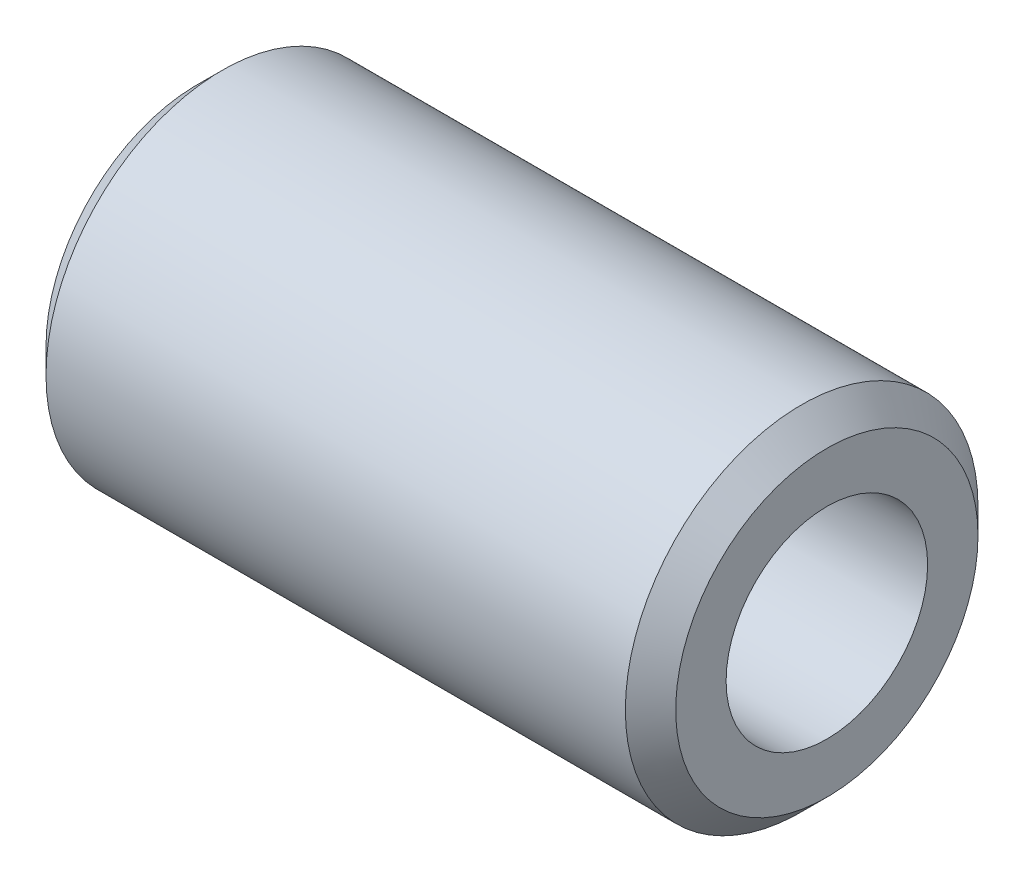
ISO-10303-21;
HEADER;
FILE_DESCRIPTION(('STEP AP214'),'2;1');
FILE_NAME('part.step','',(''),(''),'','','');
FILE_SCHEMA(('AUTOMOTIVE_DESIGN { 1 0 10303 214 1 1 1 1 }'));
ENDSEC;
DATA;
#1=APPLICATION_CONTEXT('core data for automotive mechanical design processes');
#2=APPLICATION_PROTOCOL_DEFINITION('international standard','automotive_design',2000,#1);
#3=PRODUCT_CONTEXT('',#1,'mechanical');
#4=PRODUCT('Part','Part','',(#3));
#5=PRODUCT_RELATED_PRODUCT_CATEGORY('part','',(#4));
#6=PRODUCT_DEFINITION_FORMATION('','',#4);
#7=PRODUCT_DEFINITION_CONTEXT('part definition',#1,'design');
#8=PRODUCT_DEFINITION('design','',#6,#7);
#9=PRODUCT_DEFINITION_SHAPE('','',#8);
#10=(LENGTH_UNIT() NAMED_UNIT(*) SI_UNIT(.MILLI.,.METRE.));
#11=(NAMED_UNIT(*) PLANE_ANGLE_UNIT() SI_UNIT($,.RADIAN.));
#12=(NAMED_UNIT(*) SI_UNIT($,.STERADIAN.) SOLID_ANGLE_UNIT());
#13=UNCERTAINTY_MEASURE_WITH_UNIT(LENGTH_MEASURE(1.E-05),#10,'distance_accuracy_value','');
#14=(GEOMETRIC_REPRESENTATION_CONTEXT(3) GLOBAL_UNCERTAINTY_ASSIGNED_CONTEXT((#13)) GLOBAL_UNIT_ASSIGNED_CONTEXT((#10,
#11,#12)) REPRESENTATION_CONTEXT('',''));
#15=CARTESIAN_POINT('',(0.,0.,0.));
#16=DIRECTION('',(0.,0.,1.));
#17=DIRECTION('',(1.,0.,0.));
#18=AXIS2_PLACEMENT_3D('',#15,#16,#17);
#19=CARTESIAN_POINT('',(0.,0.,0.));
#20=DIRECTION('',(1.,0.,0.));
#21=DIRECTION('',(0.,0.,-1.));
#22=AXIS2_PLACEMENT_3D('',#19,#20,#21);
#23=CYLINDRICAL_SURFACE('',#22,4.);
#24=DIRECTION('',(1.,0.,0.));
#25=VECTOR('',#24,1.);
#26=CARTESIAN_POINT('',(0.,-3.1224989991992,-2.5));
#27=LINE('',#26,#25);
#28=CARTESIAN_POINT('',(5.,-3.1224989991992,-2.5));
#29=VERTEX_POINT('',#28);
#30=CARTESIAN_POINT('',(-5.,-3.1224989991992,-2.5));
#31=VERTEX_POINT('',#30);
#32=EDGE_CURVE('E132',#29,#31,#27,.F.);
#33=ORIENTED_EDGE('',*,*,#32,.F.);
#34=CARTESIAN_POINT('',(5.,-3.1224989991992,-2.5));
#35=CARTESIAN_POINT('',(5.06259152979894,-3.1224698265075,-2.50001478195137));
#36=CARTESIAN_POINT('',(5.12516558574414,-3.12438023146388,-2.49765000899564));
#37=CARTESIAN_POINT('',(5.24967866538005,-3.13185730412988,-2.48827937635117));
#38=CARTESIAN_POINT('',(5.31161830973169,-3.13741996352647,-2.48127860455284));
#39=CARTESIAN_POINT('',(5.43386535834919,-3.1519159203747,-2.46283449114552));
#40=CARTESIAN_POINT('',(5.49418229737516,-3.16081933099102,-2.45143051571305));
#41=CARTESIAN_POINT('',(5.61332147657726,-3.18162220373253,-2.42437048439428));
#42=CARTESIAN_POINT('',(5.6721433689138,-3.19352235618452,-2.40871344871129));
#43=CARTESIAN_POINT('',(5.84534760922224,-3.23296037888671,-2.35582216083459));
#44=CARTESIAN_POINT('',(5.95708253132882,-3.26431612800015,-2.31257207045065));
#45=CARTESIAN_POINT('',(6.1717801890827,-3.33356657451354,-2.21157910045547));
#46=CARTESIAN_POINT('',(6.27472008918314,-3.37147756466322,-2.15379994297389));
#47=CARTESIAN_POINT('',(6.48374615285916,-3.455600456725,-2.01646416958164));
#48=CARTESIAN_POINT('',(6.58843085395559,-3.50224584507656,-1.93503346869445));
#49=CARTESIAN_POINT('',(6.78379848116307,-3.59507271118894,-1.75658803708245));
#50=CARTESIAN_POINT('',(6.87447458679508,-3.64125395280067,-1.65956576176771));
#51=CARTESIAN_POINT('',(7.05028325345176,-3.7346290425709,-1.43825965019518));
#52=CARTESIAN_POINT('',(7.13340034677271,-3.78126294535576,-1.31209535616145));
#53=CARTESIAN_POINT('',(7.2406608506923,-3.84314014147447,-1.11139766451856));
#54=CARTESIAN_POINT('',(7.27350250030836,-3.86241437469942,-1.04261867248746));
#55=CARTESIAN_POINT('',(7.33299272284875,-3.89772726367831,-0.901655428021563));
#56=CARTESIAN_POINT('',(7.35964584949939,-3.91376829737682,-0.829473726769763));
#57=CARTESIAN_POINT('',(7.4020728741673,-3.93950828267075,-0.695725094970947));
#58=CARTESIAN_POINT('',(7.41894435912916,-3.94983033120892,-0.634622938173076));
#59=CARTESIAN_POINT('',(7.44805573103226,-3.96772547077588,-0.510938113476973));
#60=CARTESIAN_POINT('',(7.46029676934557,-3.97529924515078,-0.44835581773668));
#61=CARTESIAN_POINT('',(7.48003731127212,-3.98754577306048,-0.321773564155004));
#62=CARTESIAN_POINT('',(7.48750768932535,-3.99220070357234,-0.257767321312125));
#63=CARTESIAN_POINT('',(7.49749723136141,-3.99843594673735,-0.129177076736932));
#64=CARTESIAN_POINT('',(7.50001292757083,-4.00001410595569,-0.0645927021073464));
#65=CARTESIAN_POINT('',(7.5,-4.,0.));
#66=B_SPLINE_CURVE_WITH_KNOTS('',3,(#34,#35,#36,#37,#38,#39,#40,#41,#42,#43,#44,#45,#46,#47,#48,
#49,#50,#51,#52,#53,#54,#55,#56,#57,#58,#59,#60,#61,#62,#63,#64,#65),.UNSPECIFIED.,.F.,.F.,(4,2,
2,2,2,2,2,2,2,2,2,2,2,2,2,4),(0.,0.187672540035425,0.375139454836844,0.560967771467721,
0.74683893456744,1.11672541852549,1.48754481183989,1.90766805925379,2.32799521519967,
2.79944306314116,3.03498506135361,3.27035318653396,3.46279855247997,3.65519603490272,
3.84875717671509,4.0424537435674),.UNSPECIFIED.);
#67=CARTESIAN_POINT('',(7.5,-4.,0.));
#68=VERTEX_POINT('',#67);
#69=EDGE_CURVE('E64',#29,#68,#66,.T.);
#70=ORIENTED_EDGE('',*,*,#69,.T.);
#71=CARTESIAN_POINT('',(7.5,-4.,0.));
#72=CARTESIAN_POINT('',(7.50001193605715,-4.00001314958439,0.0638257610720841));
#73=CARTESIAN_POINT('',(7.49755614720496,-3.99847273261745,0.127642623087671));
#74=CARTESIAN_POINT('',(7.48780169666695,-3.99238409529656,0.254727860082518));
#75=CARTESIAN_POINT('',(7.48050559689175,-3.98783746609403,0.317996507287695));
#76=CARTESIAN_POINT('',(7.46121822420798,-3.97586985460146,0.443164299501127));
#77=CARTESIAN_POINT('',(7.44925403736718,-3.96846545683401,0.505069206791391));
#78=CARTESIAN_POINT('',(7.42080200293188,-3.95096923485964,0.627429872814449));
#79=CARTESIAN_POINT('',(7.40431375732903,-3.94087717420533,0.687885503536688));
#80=CARTESIAN_POINT('',(7.34841663125765,-3.90693858294924,0.866263657143072));
#81=CARTESIAN_POINT('',(7.30252301085177,-3.87939615794153,0.981528933639002));
#82=CARTESIAN_POINT('',(7.19530175500122,-3.81673453473894,1.2024061599623));
#83=CARTESIAN_POINT('',(7.13395635860788,-3.78160662413054,1.30800680909392));
#84=CARTESIAN_POINT('',(6.9922363741172,-3.70340804306448,1.51593096857552));
#85=CARTESIAN_POINT('',(6.91074077470292,-3.65992898397767,1.61733532932201));
#86=CARTESIAN_POINT('',(6.73358062093135,-3.57063658447261,1.80595572464618));
#87=CARTESIAN_POINT('',(6.63789401602464,-3.52481968542977,1.89314922716827));
#88=CARTESIAN_POINT('',(6.41982139397636,-3.42855754334044,2.06294666903715));
#89=CARTESIAN_POINT('',(6.29557378722724,-3.37833388563042,2.1433006665183));
#90=CARTESIAN_POINT('',(6.03256451387882,-3.28651620868879,2.28160306539043));
#91=CARTESIAN_POINT('',(5.89385843403,-3.24489084903861,2.3396335271257));
#92=CARTESIAN_POINT('',(5.69016368958063,-3.19733977050394,2.40365451060931));
#93=CARTESIAN_POINT('',(5.62988028905404,-3.18482838391431,2.42016370309166));
#94=CARTESIAN_POINT('',(5.50770697834502,-3.16293537999247,2.44870631097023));
#95=CARTESIAN_POINT('',(5.44581770640067,-3.15355253917935,2.46074147623712));
#96=CARTESIAN_POINT('',(5.32030264235196,-3.13826280629678,2.48021590543506));
#97=CARTESIAN_POINT('',(5.25666614114976,-3.13238851355115,2.48761209758571));
#98=CARTESIAN_POINT('',(5.12869373277103,-3.12448787021896,2.49751556711489));
#99=CARTESIAN_POINT('',(5.06435700236886,-3.12246668852206,2.50001627739991));
#100=CARTESIAN_POINT('',(5.,-3.1224989991992,2.5));
#101=B_SPLINE_CURVE_WITH_KNOTS('',3,(#71,#72,#73,#74,#75,#76,#77,#78,#79,#80,#81,#82,#83,#84,
#85,#86,#87,#88,#89,#90,#91,#92,#93,#94,#95,#96,#97,#98,#99,#100),.UNSPECIFIED.,.F.,.F.,(4,2,2,
2,2,2,2,2,2,2,2,2,2,2,4),(0.,0.191396831954318,0.382692440910332,0.572894200838622,
0.763112699315308,1.14255082037376,1.52242709058589,1.93233645262155,2.342889554098,
2.80946660092483,3.27431175729393,3.46533839484617,3.65629023972008,3.8489897566303,
4.04194759559401),.UNSPECIFIED.);
#102=CARTESIAN_POINT('',(5.,-3.1224989991992,2.5));
#103=VERTEX_POINT('',#102);
#104=EDGE_CURVE('E130',#68,#103,#101,.T.);
#105=ORIENTED_EDGE('',*,*,#104,.T.);
#106=DIRECTION('',(1.,0.,0.));
#107=VECTOR('',#106,1.);
#108=CARTESIAN_POINT('',(0.,-3.1224989991992,2.5));
#109=LINE('',#108,#107);
#110=CARTESIAN_POINT('',(-5.,-3.1224989991992,2.5));
#111=VERTEX_POINT('',#110);
#112=EDGE_CURVE('E121',#111,#103,#109,.T.);
#113=ORIENTED_EDGE('',*,*,#112,.F.);
#114=CARTESIAN_POINT('',(-5.,-3.1224989991992,2.5));
#115=CARTESIAN_POINT('',(-5.06259152979894,-3.1224698265075,2.50001478195137));
#116=CARTESIAN_POINT('',(-5.12516558574414,-3.12438023146388,2.49765000899564));
#117=CARTESIAN_POINT('',(-5.24967866538004,-3.13185730412988,2.48827937635117));
#118=CARTESIAN_POINT('',(-5.31161830973169,-3.13741996352647,2.48127860455283));
#119=CARTESIAN_POINT('',(-5.43386535834919,-3.1519159203747,2.46283449114552));
#120=CARTESIAN_POINT('',(-5.49418229737516,-3.16081933099102,2.45143051571305));
#121=CARTESIAN_POINT('',(-5.61332147657726,-3.18162220373253,2.42437048439428));
#122=CARTESIAN_POINT('',(-5.67214336891379,-3.19352235618452,2.40871344871129));
#123=CARTESIAN_POINT('',(-5.84534760922224,-3.23296037888671,2.35582216083459));
#124=CARTESIAN_POINT('',(-5.95708253132882,-3.26431612800015,2.31257207045065));
#125=CARTESIAN_POINT('',(-6.1717801890827,-3.33356657451354,2.21157910045547));
#126=CARTESIAN_POINT('',(-6.27472008918314,-3.37147756466322,2.15379994297389));
#127=CARTESIAN_POINT('',(-6.48374615285916,-3.455600456725,2.01646416958164));
#128=CARTESIAN_POINT('',(-6.58843085395558,-3.50224584507656,1.93503346869445));
#129=CARTESIAN_POINT('',(-6.78379848116306,-3.59507271118894,1.75658803708245));
#130=CARTESIAN_POINT('',(-6.87447458679508,-3.64125395280067,1.65956576176771));
#131=CARTESIAN_POINT('',(-7.05028325345176,-3.73462904257091,1.43825965019518));
#132=CARTESIAN_POINT('',(-7.13340034677271,-3.78126294535576,1.31209535616145));
#133=CARTESIAN_POINT('',(-7.2406608506923,-3.84314014147447,1.11139766451856));
#134=CARTESIAN_POINT('',(-7.27350250030836,-3.86241437469942,1.04261867248746));
#135=CARTESIAN_POINT('',(-7.33299272284875,-3.89772726367831,0.901655428021563));
#136=CARTESIAN_POINT('',(-7.35964584949939,-3.91376829737682,0.829473726769764));
#137=CARTESIAN_POINT('',(-7.40207287416729,-3.93950828267075,0.695725094970947));
#138=CARTESIAN_POINT('',(-7.41894435912916,-3.94983033120892,0.634622938173077));
#139=CARTESIAN_POINT('',(-7.44805573103225,-3.96772547077588,0.510938113476973));
#140=CARTESIAN_POINT('',(-7.46029676934557,-3.97529924515078,0.44835581773668));
#141=CARTESIAN_POINT('',(-7.48003731127211,-3.98754577306048,0.321773564155003));
#142=CARTESIAN_POINT('',(-7.48750768932534,-3.99220070357234,0.257767321312124));
#143=CARTESIAN_POINT('',(-7.49749723136141,-3.99843594673735,0.129177076736931));
#144=CARTESIAN_POINT('',(-7.50001292757083,-4.00001410595569,0.0645927021073454));
#145=CARTESIAN_POINT('',(-7.5,-4.,0.));
#146=B_SPLINE_CURVE_WITH_KNOTS('',3,(#114,#115,#116,#117,#118,#119,#120,#121,#122,#123,#124,
#125,#126,#127,#128,#129,#130,#131,#132,#133,#134,#135,#136,#137,#138,#139,#140,#141,#142,#143,
#144,#145),.UNSPECIFIED.,.F.,.F.,(4,2,2,2,2,2,2,2,2,2,2,2,2,2,2,4),(0.,0.187672540035425,
0.375139454836844,0.56096777146772,0.74683893456744,1.11672541852549,1.48754481183989,
1.90766805925379,2.32799521519967,2.79944306314116,3.03498506135361,3.27035318653396,
3.46279855247997,3.65519603490272,3.84875717671509,4.0424537435674),.UNSPECIFIED.);
#147=CARTESIAN_POINT('',(-7.5,-4.,0.));
#148=VERTEX_POINT('',#147);
#149=EDGE_CURVE('E103',#111,#148,#146,.T.);
#150=ORIENTED_EDGE('',*,*,#149,.T.);
#151=CARTESIAN_POINT('',(-7.5,-4.,0.));
#152=CARTESIAN_POINT('',(-7.50001193605714,-4.00001314958439,-0.0638257610720846));
#153=CARTESIAN_POINT('',(-7.49755614720495,-3.99847273261745,-0.127642623087671));
#154=CARTESIAN_POINT('',(-7.48780169666695,-3.99238409529656,-0.254727860082518));
#155=CARTESIAN_POINT('',(-7.48050559689175,-3.98783746609403,-0.317996507287695));
#156=CARTESIAN_POINT('',(-7.46121822420798,-3.97586985460146,-0.443164299501128));
#157=CARTESIAN_POINT('',(-7.44925403736717,-3.96846545683401,-0.505069206791391));
#158=CARTESIAN_POINT('',(-7.42080200293188,-3.95096923485964,-0.627429872814449));
#159=CARTESIAN_POINT('',(-7.40431375732902,-3.94087717420533,-0.687885503536688));
#160=CARTESIAN_POINT('',(-7.34841663125765,-3.90693858294924,-0.866263657143073));
#161=CARTESIAN_POINT('',(-7.30252301085176,-3.87939615794153,-0.981528933639002));
#162=CARTESIAN_POINT('',(-7.19530175500122,-3.81673453473894,-1.2024061599623));
#163=CARTESIAN_POINT('',(-7.13395635860788,-3.78160662413054,-1.30800680909392));
#164=CARTESIAN_POINT('',(-6.99223637411719,-3.70340804306448,-1.51593096857552));
#165=CARTESIAN_POINT('',(-6.91074077470292,-3.65992898397767,-1.61733532932201));
#166=CARTESIAN_POINT('',(-6.73358062093134,-3.57063658447261,-1.80595572464618));
#167=CARTESIAN_POINT('',(-6.63789401602464,-3.52481968542977,-1.89314922716827));
#168=CARTESIAN_POINT('',(-6.41982139397635,-3.42855754334043,-2.06294666903715));
#169=CARTESIAN_POINT('',(-6.29557378722723,-3.37833388563042,-2.1433006665183));
#170=CARTESIAN_POINT('',(-6.03256451387881,-3.28651620868879,-2.28160306539043));
#171=CARTESIAN_POINT('',(-5.89385843403,-3.24489084903861,-2.3396335271257));
#172=CARTESIAN_POINT('',(-5.69016368958062,-3.19733977050394,-2.40365451060932));
#173=CARTESIAN_POINT('',(-5.62988028905403,-3.1848283839143,-2.42016370309166));
#174=CARTESIAN_POINT('',(-5.50770697834502,-3.16293537999247,-2.44870631097023));
#175=CARTESIAN_POINT('',(-5.44581770640067,-3.15355253917935,-2.46074147623712));
#176=CARTESIAN_POINT('',(-5.32030264235195,-3.13826280629678,-2.48021590543506));
#177=CARTESIAN_POINT('',(-5.25666614114976,-3.13238851355115,-2.48761209758571));
#178=CARTESIAN_POINT('',(-5.12869373277103,-3.12448787021896,-2.49751556711489));
#179=CARTESIAN_POINT('',(-5.06435700236885,-3.12246668852206,-2.50001627739991));
#180=CARTESIAN_POINT('',(-5.,-3.1224989991992,-2.5));
#181=B_SPLINE_CURVE_WITH_KNOTS('',3,(#151,#152,#153,#154,#155,#156,#157,#158,#159,#160,#161,
#162,#163,#164,#165,#166,#167,#168,#169,#170,#171,#172,#173,#174,#175,#176,#177,#178,#179,#180),
.UNSPECIFIED.,.F.,.F.,(4,2,2,2,2,2,2,2,2,2,2,2,2,2,4),(0.,0.191396831954318,0.382692440910332,
0.572894200838622,0.763112699315308,1.14255082037376,1.52242709058589,1.93233645262155,
2.342889554098,2.80946660092483,3.27431175729394,3.46533839484617,3.65629023972008,
3.8489897566303,4.04194759559401),.UNSPECIFIED.);
#182=EDGE_CURVE('E206',#148,#31,#181,.T.);
#183=ORIENTED_EDGE('',*,*,#182,.T.);
#184=EDGE_LOOP('',(#33,#70,#105,#113,#150,#183));
#185=FACE_BOUND('',#184,.T.);
#186=CARTESIAN_POINT('',(-12.475,0.,0.));
#187=DIRECTION('',(-1.,0.,0.));
#188=DIRECTION('',(0.,0.,1.));
#189=AXIS2_PLACEMENT_3D('',#186,#187,#188);
#190=CIRCLE('',#189,4.);
#191=CARTESIAN_POINT('',(-12.475,0.,4.));
#192=VERTEX_POINT('',#191);
#193=EDGE_CURVE('E145',#192,#192,#190,.T.);
#194=ORIENTED_EDGE('',*,*,#193,.T.);
#195=EDGE_LOOP('',(#194));
#196=FACE_BOUND('',#195,.T.);
#197=CARTESIAN_POINT('',(12.5,0.,0.));
#198=DIRECTION('',(1.,0.,0.));
#199=DIRECTION('',(0.,0.,-1.));
#200=AXIS2_PLACEMENT_3D('',#197,#198,#199);
#201=CIRCLE('',#200,4.);
#202=CARTESIAN_POINT('',(12.5,0.,-4.));
#203=VERTEX_POINT('',#202);
#204=EDGE_CURVE('E149',#203,#203,#201,.T.);
#205=ORIENTED_EDGE('',*,*,#204,.T.);
#206=EDGE_LOOP('',(#205));
#207=FACE_BOUND('',#206,.T.);
#208=ADVANCED_FACE('F47',(#185,#196,#207),#23,.F.);
#209=CARTESIAN_POINT('',(-12.5,4.,0.));
#210=DIRECTION('',(-1.,0.,0.));
#211=DIRECTION('',(0.,0.,1.));
#212=AXIS2_PLACEMENT_3D('',#209,#210,#211);
#213=PLANE('',#212);
#214=CARTESIAN_POINT('',(-12.5,0.,0.));
#215=DIRECTION('',(-1.,0.,0.));
#216=DIRECTION('',(0.,0.,1.));
#217=AXIS2_PLACEMENT_3D('',#214,#215,#216);
#218=CIRCLE('',#217,6.);
#219=CARTESIAN_POINT('',(-12.5,0.,6.));
#220=VERTEX_POINT('',#219);
#221=EDGE_CURVE('E11',#220,#220,#218,.T.);
#222=ORIENTED_EDGE('',*,*,#221,.T.);
#223=EDGE_LOOP('',(#222));
#224=FACE_BOUND('',#223,.T.);
#225=CARTESIAN_POINT('',(-12.5,0.,0.));
#226=DIRECTION('',(-1.,0.,0.));
#227=DIRECTION('',(0.,0.,1.));
#228=AXIS2_PLACEMENT_3D('',#225,#226,#227);
#229=CIRCLE('',#228,4.025);
#230=CARTESIAN_POINT('',(-12.5,0.,4.025));
#231=VERTEX_POINT('',#230);
#232=EDGE_CURVE('E137',#231,#231,#229,.T.);
#233=ORIENTED_EDGE('',*,*,#232,.F.);
#234=EDGE_LOOP('',(#233));
#235=FACE_BOUND('',#234,.T.);
#236=ADVANCED_FACE('F187',(#224,#235),#213,.T.);
#237=CARTESIAN_POINT('',(0.,0.,0.));
#238=DIRECTION('',(1.,0.,0.));
#239=DIRECTION('',(0.,0.,-1.));
#240=AXIS2_PLACEMENT_3D('',#237,#238,#239);
#241=CYLINDRICAL_SURFACE('',#240,7.);
#242=CARTESIAN_POINT('',(11.5,0.,0.));
#243=DIRECTION('',(1.,0.,0.));
#244=DIRECTION('',(0.,0.,-1.));
#245=AXIS2_PLACEMENT_3D('',#242,#243,#244);
#246=CIRCLE('',#245,7.);
#247=CARTESIAN_POINT('',(11.5,0.,-7.));
#248=VERTEX_POINT('',#247);
#249=EDGE_CURVE('E57',#248,#248,#246,.F.);
#250=ORIENTED_EDGE('',*,*,#249,.T.);
#251=EDGE_LOOP('',(#250));
#252=FACE_BOUND('',#251,.T.);
#253=CARTESIAN_POINT('',(-11.5,0.,0.));
#254=DIRECTION('',(-1.,0.,0.));
#255=DIRECTION('',(0.,0.,1.));
#256=AXIS2_PLACEMENT_3D('',#253,#254,#255);
#257=CIRCLE('',#256,7.);
#258=CARTESIAN_POINT('',(-11.5,0.,7.));
#259=VERTEX_POINT('',#258);
#260=EDGE_CURVE('E272',#259,#259,#257,.F.);
#261=ORIENTED_EDGE('',*,*,#260,.T.);
#262=EDGE_LOOP('',(#261));
#263=FACE_BOUND('',#262,.T.);
#264=DIRECTION('',(1.,0.,0.));
#265=VECTOR('',#264,1.);
#266=CARTESIAN_POINT('',(0.,-6.53834841531101,-2.5));
#267=LINE('',#266,#265);
#268=CARTESIAN_POINT('',(-5.,-6.53834841531101,-2.5));
#269=VERTEX_POINT('',#268);
#270=CARTESIAN_POINT('',(5.,-6.53834841531101,-2.5));
#271=VERTEX_POINT('',#270);
#272=EDGE_CURVE('E153',#269,#271,#267,.T.);
#273=ORIENTED_EDGE('',*,*,#272,.F.);
#274=CARTESIAN_POINT('',(-5.,-6.53834841531101,-2.5));
#275=CARTESIAN_POINT('',(-5.06789176061319,-6.53833653584086,-2.50000932444623));
#276=CARTESIAN_POINT('',(-5.13577696395944,-6.53940557744183,-2.49723464622262));
#277=CARTESIAN_POINT('',(-5.27101390792753,-6.54361696384382,-2.48618999898007));
#278=CARTESIAN_POINT('',(-5.3383658055703,-6.54675867353284,-2.47792171332017));
#279=CARTESIAN_POINT('',(-5.4718337089638,-6.55501308694937,-2.45599932254301));
#280=CARTESIAN_POINT('',(-5.5379531031587,-6.56011914226912,-2.44236338090026));
#281=CARTESIAN_POINT('',(-5.66870663911945,-6.57213229216529,-2.4098497499207));
#282=CARTESIAN_POINT('',(-5.73334071515927,-6.57903946627573,-2.39097182910556));
#283=CARTESIAN_POINT('',(-5.92426199510417,-6.60214905554765,-2.32674044961539));
#284=CARTESIAN_POINT('',(-6.04778583702168,-6.62075405324683,-2.27375315805254));
#285=CARTESIAN_POINT('',(-6.28422613371172,-6.66225312605043,-2.14911019465095));
#286=CARTESIAN_POINT('',(-6.39713437889781,-6.68515048034754,-2.07744023352399));
#287=CARTESIAN_POINT('',(-6.61421388163472,-6.73379882868167,-1.91402689638811));
#288=CARTESIAN_POINT('',(-6.71784388888591,-6.75962796045009,-1.82158634721562));
#289=CARTESIAN_POINT('',(-6.90850682770127,-6.81057540983754,-1.6207356137859));
#290=CARTESIAN_POINT('',(-6.99553627842698,-6.83569357744193,-1.51232208871062));
#291=CARTESIAN_POINT('',(-7.1531158225099,-6.88331907970163,-1.27850282117259));
#292=CARTESIAN_POINT('',(-7.22307567112586,-6.90572214958253,-1.1526765067236));
#293=CARTESIAN_POINT('',(-7.34057095983549,-6.94443563272108,-0.89014739690569));
#294=CARTESIAN_POINT('',(-7.38812893226777,-6.96075216451012,-0.753455692686566));
#295=CARTESIAN_POINT('',(-7.44886401771556,-6.98185946377716,-0.513511625377527));
#296=CARTESIAN_POINT('',(-7.46798767096466,-6.98861309237481,-0.411899416502108));
#297=CARTESIAN_POINT('',(-7.49357555188223,-6.99770556810293,-0.206881971872087));
#298=CARTESIAN_POINT('',(-7.50003713488843,-7.0000434929441,-0.103476366088815));
#299=CARTESIAN_POINT('',(-7.5,-7.,0.));
#300=B_SPLINE_CURVE_WITH_KNOTS('',3,(#274,#275,#276,#277,#278,#279,#280,#281,#282,#283,#284,
#285,#286,#287,#288,#289,#290,#291,#292,#293,#294,#295,#296,#297,#298,#299),.UNSPECIFIED.,.F.,
.F.,(4,2,2,2,2,2,2,2,2,2,2,2,4),(0.,0.20359916941444,0.407135980434993,0.609989888714331,
0.812852756157981,1.21792365461531,1.62330528194946,2.04515480156738,2.46709267844889,
2.90202857788652,3.33652606938374,3.64653458164688,3.95660783691393),.UNSPECIFIED.);
#301=CARTESIAN_POINT('',(-7.5,-7.,0.));
#302=VERTEX_POINT('',#301);
#303=EDGE_CURVE('E113',#269,#302,#300,.T.);
#304=ORIENTED_EDGE('',*,*,#303,.T.);
#305=CARTESIAN_POINT('',(-7.5,-7.,0.));
#306=CARTESIAN_POINT('',(-7.50000899848492,-7.00000923760042,0.0680316354236896));
#307=CARTESIAN_POINT('',(-7.49722320824895,-6.99900844265461,0.136057516067305));
#308=CARTESIAN_POINT('',(-7.4861319263351,-6.99505559924321,0.271584003896382));
#309=CARTESIAN_POINT('',(-7.4778278304321,-6.99210404419495,0.339084739542818));
#310=CARTESIAN_POINT('',(-7.45580320785774,-6.98433023755783,0.472878818341559));
#311=CARTESIAN_POINT('',(-7.44209918989002,-6.97951368842146,0.539175203194541));
#312=CARTESIAN_POINT('',(-7.40941651097459,-6.9681457781704,0.670285587677923));
#313=CARTESIAN_POINT('',(-7.39043768673369,-6.96159436334944,0.735099541349176));
#314=CARTESIAN_POINT('',(-7.32584074985354,-6.93958707549098,0.926587541362261));
#315=CARTESIAN_POINT('',(-7.27253121921836,-6.92176667352062,1.05049342897248));
#316=CARTESIAN_POINT('',(-7.14713334675938,-6.88161823369573,1.28757525627015));
#317=CARTESIAN_POINT('',(-7.07503352762804,-6.85928744272988,1.40074458012211));
#318=CARTESIAN_POINT('',(-6.91116162444242,-6.81147497344679,1.61757767656566));
#319=CARTESIAN_POINT('',(-6.81878957781817,-6.78591039583009,1.72077041364006));
#320=CARTESIAN_POINT('',(-6.61826078564764,-6.73493703362114,1.91057710564824));
#321=CARTESIAN_POINT('',(-6.5100986430393,-6.70952830540495,1.99718536850876));
#322=CARTESIAN_POINT('',(-6.27655772792873,-6.66079107873139,2.15426840345264));
#323=CARTESIAN_POINT('',(-6.150716146969,-6.63756364189772,2.22408896193838));
#324=CARTESIAN_POINT('',(-5.88817332242702,-6.5971282744709,2.34131680574064));
#325=CARTESIAN_POINT('',(-5.75148486925552,-6.57991337973655,2.38875004413019));
#326=CARTESIAN_POINT('',(-5.5118685819719,-6.55760626901444,2.44919145806357));
#327=CARTESIAN_POINT('',(-5.41060709353911,-6.55044807772745,2.46818785834143));
#328=CARTESIAN_POINT('',(-5.20625652174837,-6.54079023433991,2.49361416582955));
#329=CARTESIAN_POINT('',(-5.10316659319683,-6.53829279648032,2.50003810015567));
#330=CARTESIAN_POINT('',(-5.,-6.53834841531101,2.5));
#331=B_SPLINE_CURVE_WITH_KNOTS('',3,(#305,#306,#307,#308,#309,#310,#311,#312,#313,#314,#315,
#316,#317,#318,#319,#320,#321,#322,#323,#324,#325,#326,#327,#328,#329,#330),.UNSPECIFIED.,.F.,
.F.,(4,2,2,2,2,2,2,2,2,2,2,2,4),(0.,0.204020782660766,0.407989980874049,0.611340380857897,
0.814697076700547,1.220851747484,1.62725508567165,2.04787574926896,2.46864051928115,
2.90381733373915,3.33848841163286,3.64747417056643,3.95660668580006),.UNSPECIFIED.);
#332=CARTESIAN_POINT('',(-5.,-6.53834841531101,2.5));
#333=VERTEX_POINT('',#332);
#334=EDGE_CURVE('E114',#302,#333,#331,.T.);
#335=ORIENTED_EDGE('',*,*,#334,.T.);
#336=DIRECTION('',(1.,0.,0.));
#337=VECTOR('',#336,1.);
#338=CARTESIAN_POINT('',(0.,-6.53834841531101,2.5));
#339=LINE('',#338,#337);
#340=CARTESIAN_POINT('',(5.,-6.53834841531101,2.5));
#341=VERTEX_POINT('',#340);
#342=EDGE_CURVE('E123',#341,#333,#339,.F.);
#343=ORIENTED_EDGE('',*,*,#342,.F.);
#344=CARTESIAN_POINT('',(5.,-6.53834841531101,2.5));
#345=CARTESIAN_POINT('',(5.06789176061319,-6.53833653584086,2.50000932444623));
#346=CARTESIAN_POINT('',(5.13577696395944,-6.53940557744183,2.49723464622262));
#347=CARTESIAN_POINT('',(5.27101390792753,-6.54361696384382,2.48618999898007));
#348=CARTESIAN_POINT('',(5.3383658055703,-6.54675867353284,2.47792171332017));
#349=CARTESIAN_POINT('',(5.4718337089638,-6.55501308694937,2.45599932254301));
#350=CARTESIAN_POINT('',(5.5379531031587,-6.56011914226912,2.44236338090026));
#351=CARTESIAN_POINT('',(5.66870663911946,-6.57213229216529,2.4098497499207));
#352=CARTESIAN_POINT('',(5.73334071515928,-6.57903946627573,2.39097182910556));
#353=CARTESIAN_POINT('',(5.92426199510418,-6.60214905554765,2.32674044961539));
#354=CARTESIAN_POINT('',(6.04778583702169,-6.62075405324683,2.27375315805254));
#355=CARTESIAN_POINT('',(6.28422613371173,-6.66225312605043,2.14911019465095));
#356=CARTESIAN_POINT('',(6.39713437889782,-6.68515048034754,2.07744023352399));
#357=CARTESIAN_POINT('',(6.61421388163472,-6.73379882868167,1.91402689638811));
#358=CARTESIAN_POINT('',(6.71784388888591,-6.75962796045009,1.82158634721561));
#359=CARTESIAN_POINT('',(6.90850682770127,-6.81057540983754,1.6207356137859));
#360=CARTESIAN_POINT('',(6.99553627842699,-6.83569357744193,1.51232208871062));
#361=CARTESIAN_POINT('',(7.1531158225099,-6.88331907970163,1.27850282117259));
#362=CARTESIAN_POINT('',(7.22307567112587,-6.90572214958253,1.1526765067236));
#363=CARTESIAN_POINT('',(7.3405709598355,-6.94443563272108,0.89014739690569));
#364=CARTESIAN_POINT('',(7.38812893226777,-6.96075216451012,0.753455692686565));
#365=CARTESIAN_POINT('',(7.44886401771556,-6.98185946377716,0.513511625377526));
#366=CARTESIAN_POINT('',(7.46798767096467,-6.98861309237481,0.411899416502108));
#367=CARTESIAN_POINT('',(7.49357555188223,-6.99770556810293,0.206881971872087));
#368=CARTESIAN_POINT('',(7.50003713488843,-7.0000434929441,0.103476366088815));
#369=CARTESIAN_POINT('',(7.5,-7.,0.));
#370=B_SPLINE_CURVE_WITH_KNOTS('',3,(#344,#345,#346,#347,#348,#349,#350,#351,#352,#353,#354,
#355,#356,#357,#358,#359,#360,#361,#362,#363,#364,#365,#366,#367,#368,#369),.UNSPECIFIED.,.F.,
.F.,(4,2,2,2,2,2,2,2,2,2,2,2,4),(0.,0.20359916941444,0.407135980434993,0.609989888714331,
0.812852756157981,1.21792365461531,1.62330528194946,2.04515480156738,2.46709267844889,
2.90202857788652,3.33652606938374,3.64653458164688,3.95660783691393),.UNSPECIFIED.);
#371=CARTESIAN_POINT('',(7.5,-7.,0.));
#372=VERTEX_POINT('',#371);
#373=EDGE_CURVE('E72',#341,#372,#370,.T.);
#374=ORIENTED_EDGE('',*,*,#373,.T.);
#375=CARTESIAN_POINT('',(7.5,-7.,0.));
#376=CARTESIAN_POINT('',(7.50000899848493,-7.00000923760042,-0.0680316354236901));
#377=CARTESIAN_POINT('',(7.49722320824896,-6.99900844265461,-0.136057516067306));
#378=CARTESIAN_POINT('',(7.48613192633511,-6.99505559924321,-0.271584003896382));
#379=CARTESIAN_POINT('',(7.4778278304321,-6.99210404419495,-0.339084739542819));
#380=CARTESIAN_POINT('',(7.45580320785775,-6.98433023755783,-0.47287881834156));
#381=CARTESIAN_POINT('',(7.44209918989003,-6.97951368842146,-0.539175203194542));
#382=CARTESIAN_POINT('',(7.4094165109746,-6.9681457781704,-0.670285587677924));
#383=CARTESIAN_POINT('',(7.39043768673369,-6.96159436334944,-0.735099541349177));
#384=CARTESIAN_POINT('',(7.32584074985354,-6.93958707549098,-0.926587541362262));
#385=CARTESIAN_POINT('',(7.27253121921836,-6.92176667352062,-1.05049342897248));
#386=CARTESIAN_POINT('',(7.14713334675938,-6.88161823369573,-1.28757525627015));
#387=CARTESIAN_POINT('',(7.07503352762804,-6.85928744272988,-1.40074458012211));
#388=CARTESIAN_POINT('',(6.91116162444242,-6.81147497344679,-1.61757767656566));
#389=CARTESIAN_POINT('',(6.81878957781817,-6.78591039583009,-1.72077041364006));
#390=CARTESIAN_POINT('',(6.61826078564764,-6.73493703362114,-1.91057710564824));
#391=CARTESIAN_POINT('',(6.5100986430393,-6.70952830540495,-1.99718536850876));
#392=CARTESIAN_POINT('',(6.27655772792873,-6.66079107873139,-2.15426840345264));
#393=CARTESIAN_POINT('',(6.150716146969,-6.63756364189772,-2.22408896193838));
#394=CARTESIAN_POINT('',(5.88817332242702,-6.5971282744709,-2.34131680574064));
#395=CARTESIAN_POINT('',(5.75148486925552,-6.57991337973655,-2.38875004413019));
#396=CARTESIAN_POINT('',(5.5118685819719,-6.55760626901444,-2.44919145806357));
#397=CARTESIAN_POINT('',(5.41060709353912,-6.55044807772745,-2.46818785834143));
#398=CARTESIAN_POINT('',(5.20625652174838,-6.54079023433991,-2.49361416582955));
#399=CARTESIAN_POINT('',(5.10316659319684,-6.53829279648032,-2.50003810015567));
#400=CARTESIAN_POINT('',(5.,-6.53834841531101,-2.5));
#401=B_SPLINE_CURVE_WITH_KNOTS('',3,(#375,#376,#377,#378,#379,#380,#381,#382,#383,#384,#385,
#386,#387,#388,#389,#390,#391,#392,#393,#394,#395,#396,#397,#398,#399,#400),.UNSPECIFIED.,.F.,
.F.,(4,2,2,2,2,2,2,2,2,2,2,2,4),(0.,0.204020782660766,0.407989980874049,0.611340380857898,
0.814697076700548,1.220851747484,1.62725508567165,2.04787574926896,2.46864051928115,
2.90381733373915,3.33848841163286,3.64747417056643,3.95660668580006),.UNSPECIFIED.);
#402=EDGE_CURVE('E230',#372,#271,#401,.T.);
#403=ORIENTED_EDGE('',*,*,#402,.T.);
#404=EDGE_LOOP('',(#273,#304,#335,#343,#374,#403));
#405=FACE_BOUND('',#404,.T.);
#406=ADVANCED_FACE('F182',(#252,#263,#405),#241,.T.);
#407=CARTESIAN_POINT('',(12.5,7.,0.));
#408=DIRECTION('',(1.,0.,0.));
#409=DIRECTION('',(0.,0.,-1.));
#410=AXIS2_PLACEMENT_3D('',#407,#408,#409);
#411=PLANE('',#410);
#412=CARTESIAN_POINT('',(12.5,0.,0.));
#413=DIRECTION('',(1.,0.,0.));
#414=DIRECTION('',(0.,0.,-1.));
#415=AXIS2_PLACEMENT_3D('',#412,#413,#414);
#416=CIRCLE('',#415,6.);
#417=CARTESIAN_POINT('',(12.5,0.,-6.));
#418=VERTEX_POINT('',#417);
#419=EDGE_CURVE('E241',#418,#418,#416,.T.);
#420=ORIENTED_EDGE('',*,*,#419,.T.);
#421=EDGE_LOOP('',(#420));
#422=FACE_BOUND('',#421,.T.);
#423=ORIENTED_EDGE('',*,*,#204,.F.);
#424=EDGE_LOOP('',(#423));
#425=FACE_BOUND('',#424,.T.);
#426=ADVANCED_FACE('F186',(#422,#425),#411,.T.);
#427=CARTESIAN_POINT('',(-12.5,0.,0.));
#428=DIRECTION('',(-1.,0.,0.));
#429=DIRECTION('',(0.,0.,1.));
#430=AXIS2_PLACEMENT_3D('',#427,#428,#429);
#431=CONICAL_SURFACE('',#430,4.025,0.785398163397466);
#432=ORIENTED_EDGE('',*,*,#193,.F.);
#433=EDGE_LOOP('',(#432));
#434=FACE_BOUND('',#433,.T.);
#435=ORIENTED_EDGE('',*,*,#232,.T.);
#436=EDGE_LOOP('',(#435));
#437=FACE_BOUND('',#436,.T.);
#438=ADVANCED_FACE('F246',(#434,#437),#431,.F.);
#439=CARTESIAN_POINT('',(-7.5,-3.,-2.5));
#440=DIRECTION('',(0.,0.,-1.));
#441=DIRECTION('',(-1.,0.,0.));
#442=AXIS2_PLACEMENT_3D('',#439,#440,#441);
#443=PLANE('',#442);
#444=ORIENTED_EDGE('',*,*,#32,.T.);
#445=DIRECTION('',(0.,-1.,0.));
#446=VECTOR('',#445,1.);
#447=CARTESIAN_POINT('',(-5.,-6.53834841531101,-2.5));
#448=LINE('',#447,#446);
#449=EDGE_CURVE('E163',#31,#269,#448,.T.);
#450=ORIENTED_EDGE('',*,*,#449,.T.);
#451=ORIENTED_EDGE('',*,*,#272,.T.);
#452=DIRECTION('',(0.,-1.,0.));
#453=VECTOR('',#452,1.);
#454=CARTESIAN_POINT('',(5.,-3.1224989991992,-2.5));
#455=LINE('',#454,#453);
#456=EDGE_CURVE('E125',#271,#29,#455,.F.);
#457=ORIENTED_EDGE('',*,*,#456,.T.);
#458=EDGE_LOOP('',(#444,#450,#451,#457));
#459=FACE_BOUND('',#458,.T.);
#460=ADVANCED_FACE('F252',(#459),#443,.F.);
#461=CARTESIAN_POINT('',(-7.5,-3.,2.5));
#462=DIRECTION('',(0.,0.,1.));
#463=DIRECTION('',(1.,0.,0.));
#464=AXIS2_PLACEMENT_3D('',#461,#462,#463);
#465=PLANE('',#464);
#466=ORIENTED_EDGE('',*,*,#342,.T.);
#467=DIRECTION('',(0.,-1.,0.));
#468=VECTOR('',#467,1.);
#469=CARTESIAN_POINT('',(-5.,-3.1224989991992,2.5));
#470=LINE('',#469,#468);
#471=EDGE_CURVE('E107',#333,#111,#470,.F.);
#472=ORIENTED_EDGE('',*,*,#471,.T.);
#473=ORIENTED_EDGE('',*,*,#112,.T.);
#474=DIRECTION('',(0.,-1.,0.));
#475=VECTOR('',#474,1.);
#476=CARTESIAN_POINT('',(5.,-6.53834841531101,2.5));
#477=LINE('',#476,#475);
#478=EDGE_CURVE('E126',#103,#341,#477,.T.);
#479=ORIENTED_EDGE('',*,*,#478,.T.);
#480=EDGE_LOOP('',(#466,#472,#473,#479));
#481=FACE_BOUND('',#480,.T.);
#482=ADVANCED_FACE('F119',(#481),#465,.F.);
#483=CARTESIAN_POINT('',(-5.,-3.,0.));
#484=DIRECTION('',(0.,1.,0.));
#485=DIRECTION('',(0.,0.,1.));
#486=AXIS2_PLACEMENT_3D('',#483,#484,#485);
#487=CYLINDRICAL_SURFACE('',#486,2.5);
#488=ORIENTED_EDGE('',*,*,#449,.F.);
#489=ORIENTED_EDGE('',*,*,#182,.F.);
#490=DIRECTION('',(0.,-1.,0.));
#491=VECTOR('',#490,1.);
#492=CARTESIAN_POINT('',(-7.5,-3.12249899919919,0.));
#493=LINE('',#492,#491);
#494=EDGE_CURVE('E109',#302,#148,#493,.F.);
#495=ORIENTED_EDGE('',*,*,#494,.F.);
#496=ORIENTED_EDGE('',*,*,#303,.F.);
#497=EDGE_LOOP('',(#488,#489,#495,#496));
#498=FACE_BOUND('',#497,.T.);
#499=ADVANCED_FACE('F222',(#498),#487,.F.);
#500=CARTESIAN_POINT('',(-5.,-3.,0.));
#501=DIRECTION('',(0.,1.,0.));
#502=DIRECTION('',(0.,0.,1.));
#503=AXIS2_PLACEMENT_3D('',#500,#501,#502);
#504=CYLINDRICAL_SURFACE('',#503,2.5);
#505=ORIENTED_EDGE('',*,*,#149,.F.);
#506=ORIENTED_EDGE('',*,*,#471,.F.);
#507=ORIENTED_EDGE('',*,*,#334,.F.);
#508=ORIENTED_EDGE('',*,*,#494,.T.);
#509=EDGE_LOOP('',(#505,#506,#507,#508));
#510=FACE_BOUND('',#509,.T.);
#511=ADVANCED_FACE('F105',(#510),#504,.F.);
#512=CARTESIAN_POINT('',(5.,-3.,0.));
#513=DIRECTION('',(0.,1.,0.));
#514=DIRECTION('',(0.,0.,1.));
#515=AXIS2_PLACEMENT_3D('',#512,#513,#514);
#516=CYLINDRICAL_SURFACE('',#515,2.5);
#517=DIRECTION('',(0.,-1.,0.));
#518=VECTOR('',#517,1.);
#519=CARTESIAN_POINT('',(7.5,-6.53834841531101,0.));
#520=LINE('',#519,#518);
#521=EDGE_CURVE('E139',#68,#372,#520,.T.);
#522=ORIENTED_EDGE('',*,*,#521,.F.);
#523=ORIENTED_EDGE('',*,*,#69,.F.);
#524=ORIENTED_EDGE('',*,*,#456,.F.);
#525=ORIENTED_EDGE('',*,*,#402,.F.);
#526=EDGE_LOOP('',(#522,#523,#524,#525));
#527=FACE_BOUND('',#526,.T.);
#528=ADVANCED_FACE('F220',(#527),#516,.F.);
#529=CARTESIAN_POINT('',(5.,-3.,0.));
#530=DIRECTION('',(0.,1.,0.));
#531=DIRECTION('',(0.,0.,1.));
#532=AXIS2_PLACEMENT_3D('',#529,#530,#531);
#533=CYLINDRICAL_SURFACE('',#532,2.5);
#534=ORIENTED_EDGE('',*,*,#104,.F.);
#535=ORIENTED_EDGE('',*,*,#521,.T.);
#536=ORIENTED_EDGE('',*,*,#373,.F.);
#537=ORIENTED_EDGE('',*,*,#478,.F.);
#538=EDGE_LOOP('',(#534,#535,#536,#537));
#539=FACE_BOUND('',#538,.T.);
#540=ADVANCED_FACE('F215',(#539),#533,.F.);
#541=CARTESIAN_POINT('',(12.5,0.,0.));
#542=DIRECTION('',(-1.,0.,0.));
#543=DIRECTION('',(0.,0.,1.));
#544=AXIS2_PLACEMENT_3D('',#541,#542,#543);
#545=CONICAL_SURFACE('',#544,6.,0.785398163397447);
#546=ORIENTED_EDGE('',*,*,#249,.F.);
#547=EDGE_LOOP('',(#546));
#548=FACE_BOUND('',#547,.T.);
#549=ORIENTED_EDGE('',*,*,#419,.F.);
#550=EDGE_LOOP('',(#549));
#551=FACE_BOUND('',#550,.T.);
#552=ADVANCED_FACE('F219',(#548,#551),#545,.T.);
#553=CARTESIAN_POINT('',(-11.5,0.,0.));
#554=DIRECTION('',(1.,0.,0.));
#555=DIRECTION('',(0.,0.,-1.));
#556=AXIS2_PLACEMENT_3D('',#553,#554,#555);
#557=CONICAL_SURFACE('',#556,7.,0.78539816339745);
#558=ORIENTED_EDGE('',*,*,#221,.F.);
#559=EDGE_LOOP('',(#558));
#560=FACE_BOUND('',#559,.T.);
#561=ORIENTED_EDGE('',*,*,#260,.F.);
#562=EDGE_LOOP('',(#561));
#563=FACE_BOUND('',#562,.T.);
#564=ADVANCED_FACE('F50',(#560,#563),#557,.T.);
#565=CLOSED_SHELL('',(#208,#236,#406,#426,#438,#460,#482,#499,#511,#528,#540,#552,#564));
#566=MANIFOLD_SOLID_BREP('B2',#565);
#567=ADVANCED_BREP_SHAPE_REPRESENTATION('',(#18,#566),#14);
#568=SHAPE_DEFINITION_REPRESENTATION(#9,#567);
ENDSEC;
END-ISO-10303-21;
